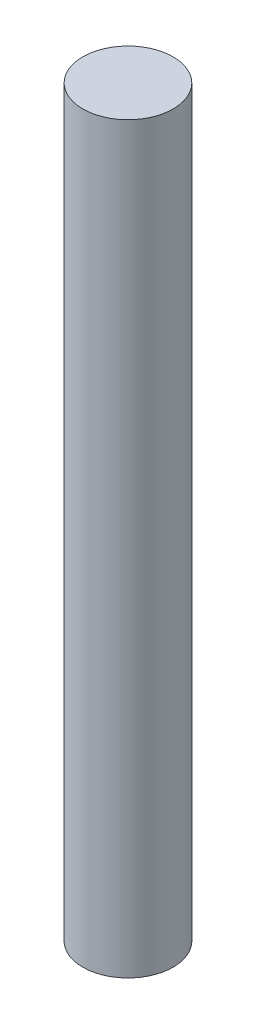
ISO-10303-21;
HEADER;
FILE_DESCRIPTION(('STEP AP214'),'2;1');
FILE_NAME('part.step','',(''),(''),'','','');
FILE_SCHEMA(('AUTOMOTIVE_DESIGN { 1 0 10303 214 1 1 1 1 }'));
ENDSEC;
DATA;
#1=APPLICATION_CONTEXT('core data for automotive mechanical design processes');
#2=APPLICATION_PROTOCOL_DEFINITION('international standard','automotive_design',2000,#1);
#3=PRODUCT_CONTEXT('',#1,'mechanical');
#4=PRODUCT('Part','Part','',(#3));
#5=PRODUCT_RELATED_PRODUCT_CATEGORY('part','',(#4));
#6=PRODUCT_DEFINITION_FORMATION('','',#4);
#7=PRODUCT_DEFINITION_CONTEXT('part definition',#1,'design');
#8=PRODUCT_DEFINITION('design','',#6,#7);
#9=PRODUCT_DEFINITION_SHAPE('','',#8);
#10=(LENGTH_UNIT() NAMED_UNIT(*) SI_UNIT(.MILLI.,.METRE.));
#11=(NAMED_UNIT(*) PLANE_ANGLE_UNIT() SI_UNIT($,.RADIAN.));
#12=(NAMED_UNIT(*) SI_UNIT($,.STERADIAN.) SOLID_ANGLE_UNIT());
#13=UNCERTAINTY_MEASURE_WITH_UNIT(LENGTH_MEASURE(1.E-05),#10,'distance_accuracy_value','');
#14=(GEOMETRIC_REPRESENTATION_CONTEXT(3) GLOBAL_UNCERTAINTY_ASSIGNED_CONTEXT((#13)) GLOBAL_UNIT_ASSIGNED_CONTEXT((#10,
#11,#12)) REPRESENTATION_CONTEXT('',''));
#15=CARTESIAN_POINT('',(0.,0.,0.));
#16=DIRECTION('',(0.,0.,1.));
#17=DIRECTION('',(1.,0.,0.));
#18=AXIS2_PLACEMENT_3D('',#15,#16,#17);
#19=CARTESIAN_POINT('',(0.,28.8,0.));
#20=DIRECTION('',(0.,-1.,0.));
#21=DIRECTION('',(0.,0.,-1.));
#22=AXIS2_PLACEMENT_3D('',#19,#20,#21);
#23=CYLINDRICAL_SURFACE('',#22,1.75);
#24=CARTESIAN_POINT('',(0.,28.8,0.));
#25=DIRECTION('',(0.,1.,0.));
#26=DIRECTION('',(0.,0.,1.));
#27=AXIS2_PLACEMENT_3D('',#24,#25,#26);
#28=CIRCLE('',#27,1.75);
#29=CARTESIAN_POINT('',(0.,28.8,1.75));
#30=VERTEX_POINT('',#29);
#31=EDGE_CURVE('E10',#30,#30,#28,.T.);
#32=ORIENTED_EDGE('',*,*,#31,.F.);
#33=EDGE_LOOP('',(#32));
#34=FACE_BOUND('',#33,.T.);
#35=CARTESIAN_POINT('',(0.,0.,0.));
#36=DIRECTION('',(0.,1.,0.));
#37=DIRECTION('',(0.,0.,1.));
#38=AXIS2_PLACEMENT_3D('',#35,#36,#37);
#39=CIRCLE('',#38,1.75);
#40=CARTESIAN_POINT('',(0.,0.,1.75));
#41=VERTEX_POINT('',#40);
#42=EDGE_CURVE('E36',#41,#41,#39,.T.);
#43=ORIENTED_EDGE('',*,*,#42,.T.);
#44=EDGE_LOOP('',(#43));
#45=FACE_BOUND('',#44,.T.);
#46=ADVANCED_FACE('F33',(#34,#45),#23,.T.);
#47=CARTESIAN_POINT('',(0.,28.8,0.));
#48=DIRECTION('',(0.,1.,0.));
#49=DIRECTION('',(0.,0.,1.));
#50=AXIS2_PLACEMENT_3D('',#47,#48,#49);
#51=PLANE('',#50);
#52=ORIENTED_EDGE('',*,*,#31,.T.);
#53=EDGE_LOOP('',(#52));
#54=FACE_BOUND('',#53,.T.);
#55=ADVANCED_FACE('F48',(#54),#51,.T.);
#56=CARTESIAN_POINT('',(0.,0.,0.));
#57=DIRECTION('',(0.,1.,0.));
#58=DIRECTION('',(0.,0.,1.));
#59=AXIS2_PLACEMENT_3D('',#56,#57,#58);
#60=PLANE('',#59);
#61=ORIENTED_EDGE('',*,*,#42,.F.);
#62=EDGE_LOOP('',(#61));
#63=FACE_BOUND('',#62,.T.);
#64=ADVANCED_FACE('F46',(#63),#60,.F.);
#65=CLOSED_SHELL('',(#46,#55,#64));
#66=MANIFOLD_SOLID_BREP('B2',#65);
#67=ADVANCED_BREP_SHAPE_REPRESENTATION('',(#18,#66),#14);
#68=SHAPE_DEFINITION_REPRESENTATION(#9,#67);
ENDSEC;
END-ISO-10303-21;
